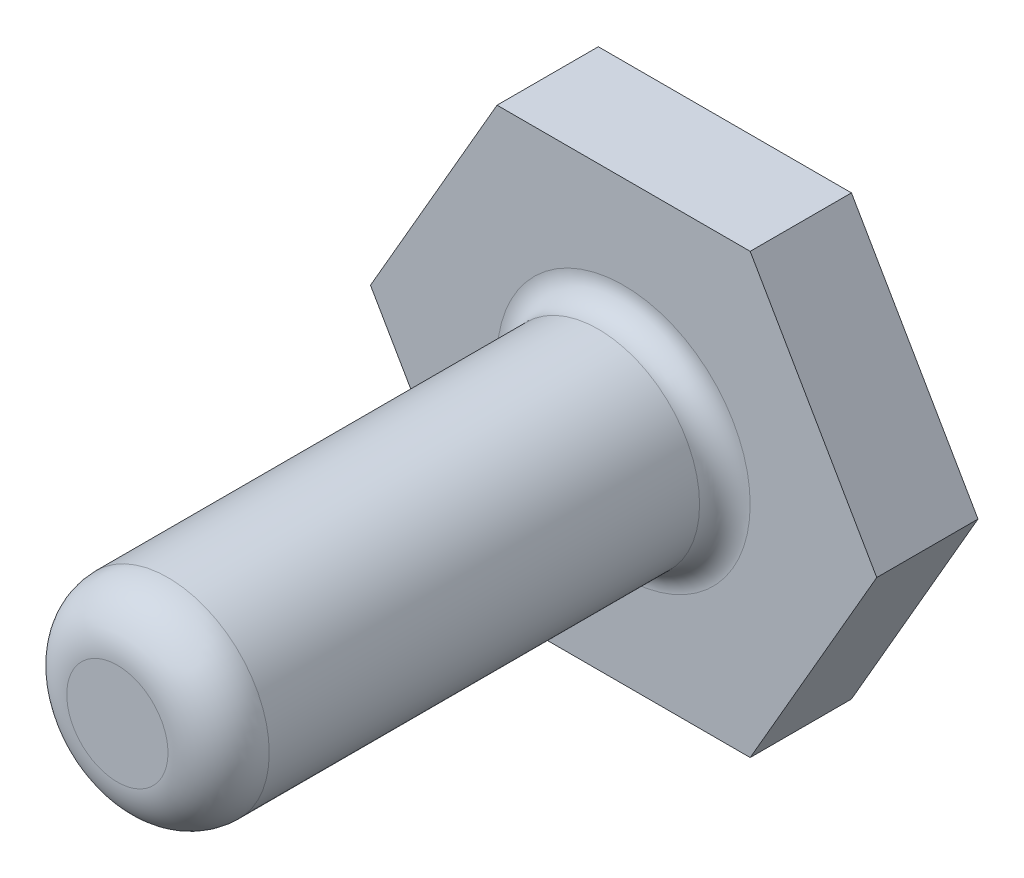
ISO-10303-21;
HEADER;
FILE_DESCRIPTION(('STEP AP214'),'2;1');
FILE_NAME('part.step','',(''),(''),'','','');
FILE_SCHEMA(('AUTOMOTIVE_DESIGN { 1 0 10303 214 1 1 1 1 }'));
ENDSEC;
DATA;
#1=APPLICATION_CONTEXT('core data for automotive mechanical design processes');
#2=APPLICATION_PROTOCOL_DEFINITION('international standard','automotive_design',2000,#1);
#3=PRODUCT_CONTEXT('',#1,'mechanical');
#4=PRODUCT('Part','Part','',(#3));
#5=PRODUCT_RELATED_PRODUCT_CATEGORY('part','',(#4));
#6=PRODUCT_DEFINITION_FORMATION('','',#4);
#7=PRODUCT_DEFINITION_CONTEXT('part definition',#1,'design');
#8=PRODUCT_DEFINITION('design','',#6,#7);
#9=PRODUCT_DEFINITION_SHAPE('','',#8);
#10=(LENGTH_UNIT() NAMED_UNIT(*) SI_UNIT(.MILLI.,.METRE.));
#11=(NAMED_UNIT(*) PLANE_ANGLE_UNIT() SI_UNIT($,.RADIAN.));
#12=(NAMED_UNIT(*) SI_UNIT($,.STERADIAN.) SOLID_ANGLE_UNIT());
#13=UNCERTAINTY_MEASURE_WITH_UNIT(LENGTH_MEASURE(1.E-05),#10,'distance_accuracy_value','');
#14=(GEOMETRIC_REPRESENTATION_CONTEXT(3) GLOBAL_UNCERTAINTY_ASSIGNED_CONTEXT((#13)) GLOBAL_UNIT_ASSIGNED_CONTEXT((#10,
#11,#12)) REPRESENTATION_CONTEXT('',''));
#15=CARTESIAN_POINT('',(0.,0.,0.));
#16=DIRECTION('',(0.,0.,1.));
#17=DIRECTION('',(1.,0.,0.));
#18=AXIS2_PLACEMENT_3D('',#15,#16,#17);
#19=CARTESIAN_POINT('',(5.,8.66025403784439,4.));
#20=DIRECTION('',(0.,0.,1.));
#21=DIRECTION('',(1.,0.,0.));
#22=AXIS2_PLACEMENT_3D('',#19,#20,#21);
#23=PLANE('',#22);
#24=CARTESIAN_POINT('',(0.,0.,4.));
#25=DIRECTION('',(0.,0.,1.));
#26=DIRECTION('',(1.,0.,0.));
#27=AXIS2_PLACEMENT_3D('',#24,#25,#26);
#28=CIRCLE('',#27,5.);
#29=CARTESIAN_POINT('',(5.,0.,4.));
#30=VERTEX_POINT('',#29);
#31=EDGE_CURVE('E144',#30,#30,#28,.F.);
#32=ORIENTED_EDGE('',*,*,#31,.T.);
#33=EDGE_LOOP('',(#32));
#34=FACE_BOUND('',#33,.T.);
#35=DIRECTION('',(-0.5,0.866025403784439,0.));
#36=VECTOR('',#35,1.);
#37=CARTESIAN_POINT('',(9.99999999999999,0.,4.));
#38=LINE('',#37,#36);
#39=CARTESIAN_POINT('',(9.99999999999999,0.,4.));
#40=VERTEX_POINT('',#39);
#41=CARTESIAN_POINT('',(5.,8.66025403784439,4.));
#42=VERTEX_POINT('',#41);
#43=EDGE_CURVE('E132',#40,#42,#38,.T.);
#44=ORIENTED_EDGE('',*,*,#43,.T.);
#45=DIRECTION('',(-1.,0.,0.));
#46=VECTOR('',#45,1.);
#47=CARTESIAN_POINT('',(5.,8.66025403784439,4.));
#48=LINE('',#47,#46);
#49=CARTESIAN_POINT('',(-5.,8.66025403784439,4.));
#50=VERTEX_POINT('',#49);
#51=EDGE_CURVE('E92',#42,#50,#48,.T.);
#52=ORIENTED_EDGE('',*,*,#51,.T.);
#53=DIRECTION('',(-0.5,-0.866025403784439,0.));
#54=VECTOR('',#53,1.);
#55=CARTESIAN_POINT('',(-5.,8.66025403784439,4.));
#56=LINE('',#55,#54);
#57=CARTESIAN_POINT('',(-10.,0.,4.));
#58=VERTEX_POINT('',#57);
#59=EDGE_CURVE('E104',#50,#58,#56,.T.);
#60=ORIENTED_EDGE('',*,*,#59,.T.);
#61=DIRECTION('',(0.5,-0.866025403784438,0.));
#62=VECTOR('',#61,1.);
#63=CARTESIAN_POINT('',(-10.,0.,4.));
#64=LINE('',#63,#62);
#65=CARTESIAN_POINT('',(-4.99999999999999,-8.66025403784439,4.));
#66=VERTEX_POINT('',#65);
#67=EDGE_CURVE('E99',#58,#66,#64,.T.);
#68=ORIENTED_EDGE('',*,*,#67,.T.);
#69=DIRECTION('',(1.,0.,0.));
#70=VECTOR('',#69,1.);
#71=CARTESIAN_POINT('',(-4.99999999999999,-8.66025403784439,4.));
#72=LINE('',#71,#70);
#73=CARTESIAN_POINT('',(5.,-8.66025403784439,4.));
#74=VERTEX_POINT('',#73);
#75=EDGE_CURVE('E102',#66,#74,#72,.T.);
#76=ORIENTED_EDGE('',*,*,#75,.T.);
#77=DIRECTION('',(0.499999999999999,0.866025403784439,0.));
#78=VECTOR('',#77,1.);
#79=CARTESIAN_POINT('',(5.,-8.66025403784439,4.));
#80=LINE('',#79,#78);
#81=EDGE_CURVE('E54',#74,#40,#80,.T.);
#82=ORIENTED_EDGE('',*,*,#81,.T.);
#83=EDGE_LOOP('',(#44,#52,#60,#68,#76,#82));
#84=FACE_BOUND('',#83,.T.);
#85=ADVANCED_FACE('F37',(#34,#84),#23,.T.);
#86=CARTESIAN_POINT('',(9.99999999999999,0.,4.));
#87=DIRECTION('',(-0.866025403784439,-0.5,0.));
#88=DIRECTION('',(0.5,-0.866025403784439,0.));
#89=AXIS2_PLACEMENT_3D('',#86,#87,#88);
#90=PLANE('',#89);
#91=DIRECTION('',(-0.5,0.866025403784439,0.));
#92=VECTOR('',#91,1.);
#93=CARTESIAN_POINT('',(9.99999999999999,0.,0.));
#94=LINE('',#93,#92);
#95=CARTESIAN_POINT('',(9.99999999999999,0.,0.));
#96=VERTEX_POINT('',#95);
#97=CARTESIAN_POINT('',(5.,8.66025403784439,0.));
#98=VERTEX_POINT('',#97);
#99=EDGE_CURVE('E122',#96,#98,#94,.T.);
#100=ORIENTED_EDGE('',*,*,#99,.T.);
#101=DIRECTION('',(0.,0.,-1.));
#102=VECTOR('',#101,1.);
#103=CARTESIAN_POINT('',(5.,8.66025403784439,4.));
#104=LINE('',#103,#102);
#105=EDGE_CURVE('E139',#42,#98,#104,.T.);
#106=ORIENTED_EDGE('',*,*,#105,.F.);
#107=ORIENTED_EDGE('',*,*,#43,.F.);
#108=DIRECTION('',(0.,0.,-1.));
#109=VECTOR('',#108,1.);
#110=CARTESIAN_POINT('',(9.99999999999999,0.,4.));
#111=LINE('',#110,#109);
#112=EDGE_CURVE('E118',#40,#96,#111,.T.);
#113=ORIENTED_EDGE('',*,*,#112,.T.);
#114=EDGE_LOOP('',(#100,#106,#107,#113));
#115=FACE_BOUND('',#114,.T.);
#116=ADVANCED_FACE('F160',(#115),#90,.F.);
#117=CARTESIAN_POINT('',(5.,8.66025403784439,4.));
#118=DIRECTION('',(0.,-1.,0.));
#119=DIRECTION('',(0.,0.,-1.));
#120=AXIS2_PLACEMENT_3D('',#117,#118,#119);
#121=PLANE('',#120);
#122=DIRECTION('',(-1.,0.,0.));
#123=VECTOR('',#122,1.);
#124=CARTESIAN_POINT('',(5.,8.66025403784439,0.));
#125=LINE('',#124,#123);
#126=CARTESIAN_POINT('',(-5.,8.66025403784439,0.));
#127=VERTEX_POINT('',#126);
#128=EDGE_CURVE('E125',#98,#127,#125,.T.);
#129=ORIENTED_EDGE('',*,*,#128,.T.);
#130=DIRECTION('',(0.,0.,-1.));
#131=VECTOR('',#130,1.);
#132=CARTESIAN_POINT('',(-5.,8.66025403784439,4.));
#133=LINE('',#132,#131);
#134=EDGE_CURVE('E136',#50,#127,#133,.T.);
#135=ORIENTED_EDGE('',*,*,#134,.F.);
#136=ORIENTED_EDGE('',*,*,#51,.F.);
#137=ORIENTED_EDGE('',*,*,#105,.T.);
#138=EDGE_LOOP('',(#129,#135,#136,#137));
#139=FACE_BOUND('',#138,.T.);
#140=ADVANCED_FACE('F166',(#139),#121,.F.);
#141=CARTESIAN_POINT('',(-5.,8.66025403784439,4.));
#142=DIRECTION('',(0.866025403784439,-0.5,0.));
#143=DIRECTION('',(0.5,0.866025403784439,0.));
#144=AXIS2_PLACEMENT_3D('',#141,#142,#143);
#145=PLANE('',#144);
#146=DIRECTION('',(-0.5,-0.866025403784439,0.));
#147=VECTOR('',#146,1.);
#148=CARTESIAN_POINT('',(-5.,8.66025403784439,0.));
#149=LINE('',#148,#147);
#150=CARTESIAN_POINT('',(-10.,0.,0.));
#151=VERTEX_POINT('',#150);
#152=EDGE_CURVE('E127',#127,#151,#149,.T.);
#153=ORIENTED_EDGE('',*,*,#152,.T.);
#154=DIRECTION('',(0.,0.,-1.));
#155=VECTOR('',#154,1.);
#156=CARTESIAN_POINT('',(-10.,0.,4.));
#157=LINE('',#156,#155);
#158=EDGE_CURVE('E113',#58,#151,#157,.T.);
#159=ORIENTED_EDGE('',*,*,#158,.F.);
#160=ORIENTED_EDGE('',*,*,#59,.F.);
#161=ORIENTED_EDGE('',*,*,#134,.T.);
#162=EDGE_LOOP('',(#153,#159,#160,#161));
#163=FACE_BOUND('',#162,.T.);
#164=ADVANCED_FACE('F184',(#163),#145,.F.);
#165=CARTESIAN_POINT('',(-10.,0.,4.));
#166=DIRECTION('',(0.866025403784439,0.5,0.));
#167=DIRECTION('',(-0.5,0.866025403784438,0.));
#168=AXIS2_PLACEMENT_3D('',#165,#166,#167);
#169=PLANE('',#168);
#170=DIRECTION('',(0.5,-0.866025403784438,0.));
#171=VECTOR('',#170,1.);
#172=CARTESIAN_POINT('',(-10.,0.,0.));
#173=LINE('',#172,#171);
#174=CARTESIAN_POINT('',(-4.99999999999999,-8.66025403784439,0.));
#175=VERTEX_POINT('',#174);
#176=EDGE_CURVE('E112',#151,#175,#173,.T.);
#177=ORIENTED_EDGE('',*,*,#176,.T.);
#178=DIRECTION('',(0.,0.,-1.));
#179=VECTOR('',#178,1.);
#180=CARTESIAN_POINT('',(-4.99999999999999,-8.66025403784439,4.));
#181=LINE('',#180,#179);
#182=EDGE_CURVE('E109',#66,#175,#181,.T.);
#183=ORIENTED_EDGE('',*,*,#182,.F.);
#184=ORIENTED_EDGE('',*,*,#67,.F.);
#185=ORIENTED_EDGE('',*,*,#158,.T.);
#186=EDGE_LOOP('',(#177,#183,#184,#185));
#187=FACE_BOUND('',#186,.T.);
#188=ADVANCED_FACE('F110',(#187),#169,.F.);
#189=CARTESIAN_POINT('',(-4.99999999999999,-8.66025403784439,4.));
#190=DIRECTION('',(0.,1.,0.));
#191=DIRECTION('',(0.,0.,1.));
#192=AXIS2_PLACEMENT_3D('',#189,#190,#191);
#193=PLANE('',#192);
#194=DIRECTION('',(1.,0.,0.));
#195=VECTOR('',#194,1.);
#196=CARTESIAN_POINT('',(-4.99999999999999,-8.66025403784439,0.));
#197=LINE('',#196,#195);
#198=CARTESIAN_POINT('',(5.,-8.66025403784439,0.));
#199=VERTEX_POINT('',#198);
#200=EDGE_CURVE('E77',#175,#199,#197,.T.);
#201=ORIENTED_EDGE('',*,*,#200,.T.);
#202=DIRECTION('',(0.,0.,-1.));
#203=VECTOR('',#202,1.);
#204=CARTESIAN_POINT('',(5.,-8.66025403784439,4.));
#205=LINE('',#204,#203);
#206=EDGE_CURVE('E114',#74,#199,#205,.T.);
#207=ORIENTED_EDGE('',*,*,#206,.F.);
#208=ORIENTED_EDGE('',*,*,#75,.F.);
#209=ORIENTED_EDGE('',*,*,#182,.T.);
#210=EDGE_LOOP('',(#201,#207,#208,#209));
#211=FACE_BOUND('',#210,.T.);
#212=ADVANCED_FACE('F116',(#211),#193,.F.);
#213=CARTESIAN_POINT('',(5.,-8.66025403784439,4.));
#214=DIRECTION('',(-0.866025403784439,0.499999999999999,0.));
#215=DIRECTION('',(-0.499999999999999,-0.866025403784439,0.));
#216=AXIS2_PLACEMENT_3D('',#213,#214,#215);
#217=PLANE('',#216);
#218=DIRECTION('',(0.499999999999999,0.866025403784439,0.));
#219=VECTOR('',#218,1.);
#220=CARTESIAN_POINT('',(5.,-8.66025403784439,0.));
#221=LINE('',#220,#219);
#222=EDGE_CURVE('E83',#199,#96,#221,.T.);
#223=ORIENTED_EDGE('',*,*,#222,.T.);
#224=ORIENTED_EDGE('',*,*,#112,.F.);
#225=ORIENTED_EDGE('',*,*,#81,.F.);
#226=ORIENTED_EDGE('',*,*,#206,.T.);
#227=EDGE_LOOP('',(#223,#224,#225,#226));
#228=FACE_BOUND('',#227,.T.);
#229=ADVANCED_FACE('F176',(#228),#217,.F.);
#230=CARTESIAN_POINT('',(5.,8.66025403784439,0.));
#231=DIRECTION('',(0.,0.,1.));
#232=DIRECTION('',(1.,0.,0.));
#233=AXIS2_PLACEMENT_3D('',#230,#231,#232);
#234=PLANE('',#233);
#235=ORIENTED_EDGE('',*,*,#99,.F.);
#236=ORIENTED_EDGE('',*,*,#222,.F.);
#237=ORIENTED_EDGE('',*,*,#200,.F.);
#238=ORIENTED_EDGE('',*,*,#176,.F.);
#239=ORIENTED_EDGE('',*,*,#152,.F.);
#240=ORIENTED_EDGE('',*,*,#128,.F.);
#241=EDGE_LOOP('',(#235,#236,#237,#238,#239,#240));
#242=FACE_BOUND('',#241,.T.);
#243=ADVANCED_FACE('F173',(#242),#234,.F.);
#244=CARTESIAN_POINT('',(0.,0.,24.));
#245=DIRECTION('',(0.,0.,-1.));
#246=DIRECTION('',(-1.,0.,0.));
#247=AXIS2_PLACEMENT_3D('',#244,#245,#246);
#248=CYLINDRICAL_SURFACE('',#247,4.);
#249=CARTESIAN_POINT('',(0.,0.,22.));
#250=DIRECTION('',(0.,0.,1.));
#251=DIRECTION('',(1.,0.,0.));
#252=AXIS2_PLACEMENT_3D('',#249,#250,#251);
#253=CIRCLE('',#252,4.);
#254=CARTESIAN_POINT('',(4.,0.,22.));
#255=VERTEX_POINT('',#254);
#256=EDGE_CURVE('E11',#255,#255,#253,.F.);
#257=ORIENTED_EDGE('',*,*,#256,.T.);
#258=EDGE_LOOP('',(#257));
#259=FACE_BOUND('',#258,.T.);
#260=CARTESIAN_POINT('',(0.,0.,5.));
#261=DIRECTION('',(0.,0.,1.));
#262=DIRECTION('',(1.,0.,0.));
#263=AXIS2_PLACEMENT_3D('',#260,#261,#262);
#264=CIRCLE('',#263,4.);
#265=CARTESIAN_POINT('',(4.,0.,5.));
#266=VERTEX_POINT('',#265);
#267=EDGE_CURVE('E141',#266,#266,#264,.T.);
#268=ORIENTED_EDGE('',*,*,#267,.T.);
#269=EDGE_LOOP('',(#268));
#270=FACE_BOUND('',#269,.T.);
#271=ADVANCED_FACE('F171',(#259,#270),#248,.T.);
#272=CARTESIAN_POINT('',(0.,0.,24.));
#273=DIRECTION('',(0.,0.,1.));
#274=DIRECTION('',(1.,0.,0.));
#275=AXIS2_PLACEMENT_3D('',#272,#273,#274);
#276=PLANE('',#275);
#277=CARTESIAN_POINT('',(0.,0.,24.));
#278=DIRECTION('',(0.,0.,1.));
#279=DIRECTION('',(1.,0.,0.));
#280=AXIS2_PLACEMENT_3D('',#277,#278,#279);
#281=CIRCLE('',#280,2.);
#282=CARTESIAN_POINT('',(2.,0.,24.));
#283=VERTEX_POINT('',#282);
#284=EDGE_CURVE('E46',#283,#283,#281,.T.);
#285=ORIENTED_EDGE('',*,*,#284,.T.);
#286=EDGE_LOOP('',(#285));
#287=FACE_BOUND('',#286,.T.);
#288=ADVANCED_FACE('F149',(#287),#276,.T.);
#289=CARTESIAN_POINT('',(0.,0.,5.));
#290=DIRECTION('',(0.,0.,1.));
#291=DIRECTION('',(1.,0.,0.));
#292=AXIS2_PLACEMENT_3D('',#289,#290,#291);
#293=TOROIDAL_SURFACE('',#292,5.,1.);
#294=ORIENTED_EDGE('',*,*,#31,.F.);
#295=EDGE_LOOP('',(#294));
#296=FACE_BOUND('',#295,.T.);
#297=ORIENTED_EDGE('',*,*,#267,.F.);
#298=EDGE_LOOP('',(#297));
#299=FACE_BOUND('',#298,.T.);
#300=ADVANCED_FACE('F152',(#296,#299),#293,.F.);
#301=CARTESIAN_POINT('',(0.,0.,22.));
#302=DIRECTION('',(0.,0.,1.));
#303=DIRECTION('',(1.,0.,0.));
#304=AXIS2_PLACEMENT_3D('',#301,#302,#303);
#305=DEGENERATE_TOROIDAL_SURFACE('',#304,2.,2.,.T.);
#306=ORIENTED_EDGE('',*,*,#256,.F.);
#307=EDGE_LOOP('',(#306));
#308=FACE_BOUND('',#307,.T.);
#309=ORIENTED_EDGE('',*,*,#284,.F.);
#310=EDGE_LOOP('',(#309));
#311=FACE_BOUND('',#310,.T.);
#312=ADVANCED_FACE('F39',(#308,#311),#305,.T.);
#313=CLOSED_SHELL('',(#85,#116,#140,#164,#188,#212,#229,#243,#271,#288,#300,#312));
#314=MANIFOLD_SOLID_BREP('B2',#313);
#315=ADVANCED_BREP_SHAPE_REPRESENTATION('',(#18,#314),#14);
#316=SHAPE_DEFINITION_REPRESENTATION(#9,#315);
ENDSEC;
END-ISO-10303-21;
